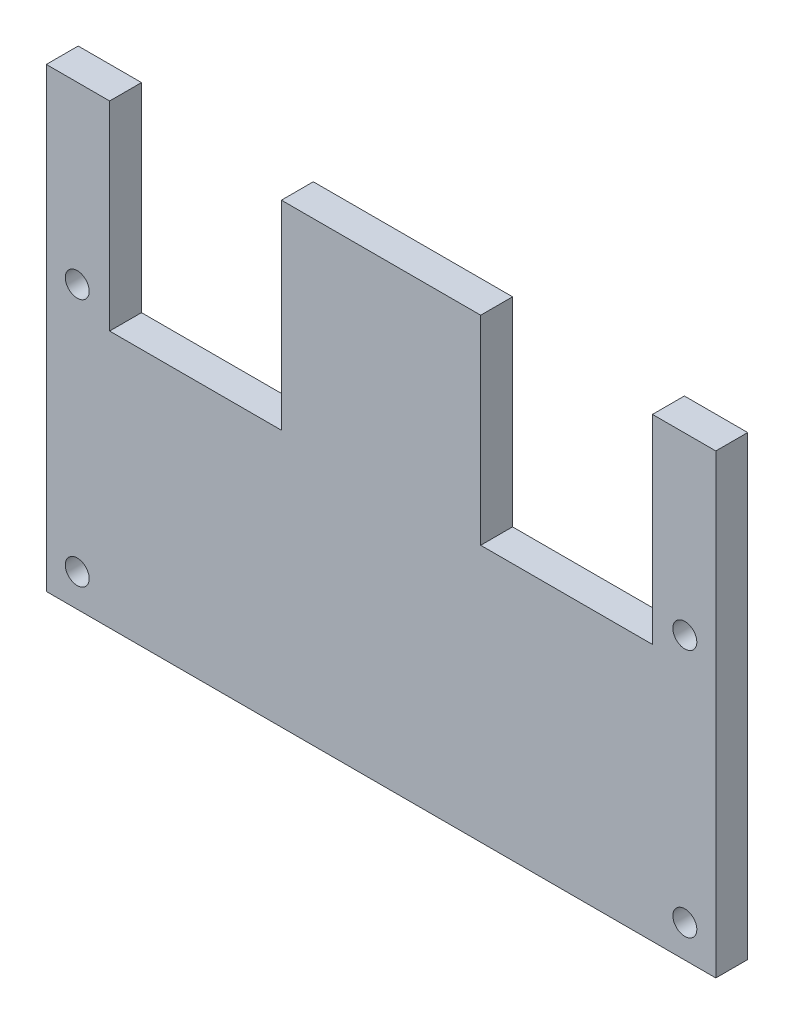
ISO-10303-21;
HEADER;
FILE_DESCRIPTION(('STEP AP214'),'2;1');
FILE_NAME('part.step','',(''),(''),'','','');
FILE_SCHEMA(('AUTOMOTIVE_DESIGN { 1 0 10303 214 1 1 1 1 }'));
ENDSEC;
DATA;
#1=APPLICATION_CONTEXT('core data for automotive mechanical design processes');
#2=APPLICATION_PROTOCOL_DEFINITION('international standard','automotive_design',2000,#1);
#3=PRODUCT_CONTEXT('',#1,'mechanical');
#4=PRODUCT('Part','Part','',(#3));
#5=PRODUCT_RELATED_PRODUCT_CATEGORY('part','',(#4));
#6=PRODUCT_DEFINITION_FORMATION('','',#4);
#7=PRODUCT_DEFINITION_CONTEXT('part definition',#1,'design');
#8=PRODUCT_DEFINITION('design','',#6,#7);
#9=PRODUCT_DEFINITION_SHAPE('','',#8);
#10=(LENGTH_UNIT() NAMED_UNIT(*) SI_UNIT(.MILLI.,.METRE.));
#11=(NAMED_UNIT(*) PLANE_ANGLE_UNIT() SI_UNIT($,.RADIAN.));
#12=(NAMED_UNIT(*) SI_UNIT($,.STERADIAN.) SOLID_ANGLE_UNIT());
#13=UNCERTAINTY_MEASURE_WITH_UNIT(LENGTH_MEASURE(1.E-05),#10,'distance_accuracy_value','');
#14=(GEOMETRIC_REPRESENTATION_CONTEXT(3) GLOBAL_UNCERTAINTY_ASSIGNED_CONTEXT((#13)) GLOBAL_UNIT_ASSIGNED_CONTEXT((#10,
#11,#12)) REPRESENTATION_CONTEXT('',''));
#15=CARTESIAN_POINT('',(0.,0.,0.));
#16=DIRECTION('',(0.,0.,1.));
#17=DIRECTION('',(1.,0.,0.));
#18=AXIS2_PLACEMENT_3D('',#15,#16,#17);
#19=CARTESIAN_POINT('',(-12.6363941032133,32.2691800709723,4.));
#20=DIRECTION('',(-1.,0.,0.));
#21=DIRECTION('',(0.,0.,1.));
#22=AXIS2_PLACEMENT_3D('',#19,#20,#21);
#23=PLANE('',#22);
#24=DIRECTION('',(0.,1.,0.));
#25=VECTOR('',#24,1.);
#26=CARTESIAN_POINT('',(-12.6363941032133,32.2691800709723,0.));
#27=LINE('',#26,#25);
#28=CARTESIAN_POINT('',(-12.6363941032133,32.2691800709723,0.));
#29=VERTEX_POINT('',#28);
#30=CARTESIAN_POINT('',(-12.6363941032133,57.269180070972,0.));
#31=VERTEX_POINT('',#30);
#32=EDGE_CURVE('E163',#29,#31,#27,.T.);
#33=ORIENTED_EDGE('',*,*,#32,.F.);
#34=DIRECTION('',(0.,0.,-1.));
#35=VECTOR('',#34,1.);
#36=CARTESIAN_POINT('',(-12.6363941032133,32.2691800709723,4.));
#37=LINE('',#36,#35);
#38=CARTESIAN_POINT('',(-12.6363941032133,32.2691800709723,4.));
#39=VERTEX_POINT('',#38);
#40=EDGE_CURVE('E11',#39,#29,#37,.T.);
#41=ORIENTED_EDGE('',*,*,#40,.F.);
#42=DIRECTION('',(0.,1.,0.));
#43=VECTOR('',#42,1.);
#44=CARTESIAN_POINT('',(-12.6363941032133,32.2691800709723,4.));
#45=LINE('',#44,#43);
#46=CARTESIAN_POINT('',(-12.6363941032133,57.269180070972,4.));
#47=VERTEX_POINT('',#46);
#48=EDGE_CURVE('E195',#39,#47,#45,.T.);
#49=ORIENTED_EDGE('',*,*,#48,.T.);
#50=DIRECTION('',(0.,0.,-1.));
#51=VECTOR('',#50,1.);
#52=CARTESIAN_POINT('',(-12.6363941032133,57.269180070972,4.));
#53=LINE('',#52,#51);
#54=EDGE_CURVE('E46',#47,#31,#53,.T.);
#55=ORIENTED_EDGE('',*,*,#54,.T.);
#56=EDGE_LOOP('',(#33,#41,#49,#55));
#57=FACE_BOUND('',#56,.T.);
#58=ADVANCED_FACE('F43',(#57),#23,.T.);
#59=CARTESIAN_POINT('',(-34.1913941032133,32.2691800709723,4.));
#60=DIRECTION('',(0.,1.,0.));
#61=DIRECTION('',(-1.,0.,0.));
#62=AXIS2_PLACEMENT_3D('',#59,#60,#61);
#63=PLANE('',#62);
#64=DIRECTION('',(1.,0.,0.));
#65=VECTOR('',#64,1.);
#66=CARTESIAN_POINT('',(-34.1913941032133,32.2691800709723,0.));
#67=LINE('',#66,#65);
#68=CARTESIAN_POINT('',(-34.1913941032133,32.2691800709723,0.));
#69=VERTEX_POINT('',#68);
#70=EDGE_CURVE('E193',#69,#29,#67,.T.);
#71=ORIENTED_EDGE('',*,*,#70,.F.);
#72=DIRECTION('',(0.,0.,-1.));
#73=VECTOR('',#72,1.);
#74=CARTESIAN_POINT('',(-34.1913941032133,32.2691800709723,4.));
#75=LINE('',#74,#73);
#76=CARTESIAN_POINT('',(-34.1913941032133,32.2691800709723,4.));
#77=VERTEX_POINT('',#76);
#78=EDGE_CURVE('E52',#77,#69,#75,.T.);
#79=ORIENTED_EDGE('',*,*,#78,.F.);
#80=DIRECTION('',(1.,0.,0.));
#81=VECTOR('',#80,1.);
#82=CARTESIAN_POINT('',(-34.1913941032133,32.2691800709723,4.));
#83=LINE('',#82,#81);
#84=EDGE_CURVE('E143',#77,#39,#83,.T.);
#85=ORIENTED_EDGE('',*,*,#84,.T.);
#86=ORIENTED_EDGE('',*,*,#40,.T.);
#87=EDGE_LOOP('',(#71,#79,#85,#86));
#88=FACE_BOUND('',#87,.T.);
#89=ADVANCED_FACE('F217',(#88),#63,.T.);
#90=CARTESIAN_POINT('',(-34.1913941032133,32.2691800709723,4.));
#91=DIRECTION('',(-1.,0.,0.));
#92=DIRECTION('',(0.,0.,1.));
#93=AXIS2_PLACEMENT_3D('',#90,#91,#92);
#94=PLANE('',#93);
#95=DIRECTION('',(0.,1.,0.));
#96=VECTOR('',#95,1.);
#97=CARTESIAN_POINT('',(-34.1913941032133,32.2691800709723,0.));
#98=LINE('',#97,#96);
#99=CARTESIAN_POINT('',(-34.1913941032133,57.269180070972,0.));
#100=VERTEX_POINT('',#99);
#101=EDGE_CURVE('E148',#69,#100,#98,.T.);
#102=ORIENTED_EDGE('',*,*,#101,.T.);
#103=DIRECTION('',(0.,0.,-1.));
#104=VECTOR('',#103,1.);
#105=CARTESIAN_POINT('',(-34.1913941032133,57.269180070972,4.));
#106=LINE('',#105,#104);
#107=CARTESIAN_POINT('',(-34.1913941032133,57.269180070972,4.));
#108=VERTEX_POINT('',#107);
#109=EDGE_CURVE('E146',#108,#100,#106,.T.);
#110=ORIENTED_EDGE('',*,*,#109,.F.);
#111=DIRECTION('',(0.,1.,0.));
#112=VECTOR('',#111,1.);
#113=CARTESIAN_POINT('',(-34.1913941032133,32.2691800709723,4.));
#114=LINE('',#113,#112);
#115=EDGE_CURVE('E137',#77,#108,#114,.T.);
#116=ORIENTED_EDGE('',*,*,#115,.F.);
#117=ORIENTED_EDGE('',*,*,#78,.T.);
#118=EDGE_LOOP('',(#102,#110,#116,#117));
#119=FACE_BOUND('',#118,.T.);
#120=ADVANCED_FACE('F147',(#119),#94,.F.);
#121=CARTESIAN_POINT('',(-34.1913941032133,57.269180070972,4.));
#122=DIRECTION('',(0.,-1.,0.));
#123=DIRECTION('',(1.,0.,0.));
#124=AXIS2_PLACEMENT_3D('',#121,#122,#123);
#125=PLANE('',#124);
#126=DIRECTION('',(-1.,0.,0.));
#127=VECTOR('',#126,1.);
#128=CARTESIAN_POINT('',(-34.1913941032133,57.269180070972,0.));
#129=LINE('',#128,#127);
#130=CARTESIAN_POINT('',(-42.1363941032133,57.269180070972,0.));
#131=VERTEX_POINT('',#130);
#132=EDGE_CURVE('E190',#100,#131,#129,.T.);
#133=ORIENTED_EDGE('',*,*,#132,.T.);
#134=DIRECTION('',(0.,0.,-1.));
#135=VECTOR('',#134,1.);
#136=CARTESIAN_POINT('',(-42.1363941032133,57.269180070972,4.));
#137=LINE('',#136,#135);
#138=CARTESIAN_POINT('',(-42.1363941032133,57.269180070972,4.));
#139=VERTEX_POINT('',#138);
#140=EDGE_CURVE('E151',#139,#131,#137,.T.);
#141=ORIENTED_EDGE('',*,*,#140,.F.);
#142=DIRECTION('',(-1.,0.,0.));
#143=VECTOR('',#142,1.);
#144=CARTESIAN_POINT('',(-34.1913941032133,57.269180070972,4.));
#145=LINE('',#144,#143);
#146=EDGE_CURVE('E141',#108,#139,#145,.T.);
#147=ORIENTED_EDGE('',*,*,#146,.F.);
#148=ORIENTED_EDGE('',*,*,#109,.T.);
#149=EDGE_LOOP('',(#133,#141,#147,#148));
#150=FACE_BOUND('',#149,.T.);
#151=ADVANCED_FACE('F153',(#150),#125,.F.);
#152=CARTESIAN_POINT('',(-42.1363941032133,57.269180070972,4.));
#153=DIRECTION('',(1.,0.,0.));
#154=DIRECTION('',(0.,1.,0.));
#155=AXIS2_PLACEMENT_3D('',#152,#153,#154);
#156=PLANE('',#155);
#157=DIRECTION('',(0.,-1.,0.));
#158=VECTOR('',#157,1.);
#159=CARTESIAN_POINT('',(-42.1363941032133,57.269180070972,0.));
#160=LINE('',#159,#158);
#161=CARTESIAN_POINT('',(-42.1363941032133,0.,0.));
#162=VERTEX_POINT('',#161);
#163=EDGE_CURVE('E188',#131,#162,#160,.T.);
#164=ORIENTED_EDGE('',*,*,#163,.T.);
#165=DIRECTION('',(0.,0.,-1.));
#166=VECTOR('',#165,1.);
#167=CARTESIAN_POINT('',(-42.1363941032133,0.,4.));
#168=LINE('',#167,#166);
#169=CARTESIAN_POINT('',(-42.1363941032133,0.,4.));
#170=VERTEX_POINT('',#169);
#171=EDGE_CURVE('E199',#170,#162,#168,.T.);
#172=ORIENTED_EDGE('',*,*,#171,.F.);
#173=DIRECTION('',(0.,-1.,0.));
#174=VECTOR('',#173,1.);
#175=CARTESIAN_POINT('',(-42.1363941032133,57.269180070972,4.));
#176=LINE('',#175,#174);
#177=EDGE_CURVE('E156',#139,#170,#176,.T.);
#178=ORIENTED_EDGE('',*,*,#177,.F.);
#179=ORIENTED_EDGE('',*,*,#140,.T.);
#180=EDGE_LOOP('',(#164,#172,#178,#179));
#181=FACE_BOUND('',#180,.T.);
#182=ADVANCED_FACE('F230',(#181),#156,.F.);
#183=CARTESIAN_POINT('',(-42.1363941032133,0.,4.));
#184=DIRECTION('',(0.,1.,0.));
#185=DIRECTION('',(0.,0.,1.));
#186=AXIS2_PLACEMENT_3D('',#183,#184,#185);
#187=PLANE('',#186);
#188=DIRECTION('',(1.,0.,0.));
#189=VECTOR('',#188,1.);
#190=CARTESIAN_POINT('',(-42.1363941032133,0.,0.));
#191=LINE('',#190,#189);
#192=CARTESIAN_POINT('',(41.8636058967867,0.,0.));
#193=VERTEX_POINT('',#192);
#194=EDGE_CURVE('E185',#162,#193,#191,.T.);
#195=ORIENTED_EDGE('',*,*,#194,.T.);
#196=DIRECTION('',(0.,0.,-1.));
#197=VECTOR('',#196,1.);
#198=CARTESIAN_POINT('',(41.8636058967867,0.,4.));
#199=LINE('',#198,#197);
#200=CARTESIAN_POINT('',(41.8636058967867,0.,4.));
#201=VERTEX_POINT('',#200);
#202=EDGE_CURVE('E202',#201,#193,#199,.T.);
#203=ORIENTED_EDGE('',*,*,#202,.F.);
#204=DIRECTION('',(1.,0.,0.));
#205=VECTOR('',#204,1.);
#206=CARTESIAN_POINT('',(-42.1363941032133,0.,4.));
#207=LINE('',#206,#205);
#208=EDGE_CURVE('E158',#170,#201,#207,.T.);
#209=ORIENTED_EDGE('',*,*,#208,.F.);
#210=ORIENTED_EDGE('',*,*,#171,.T.);
#211=EDGE_LOOP('',(#195,#203,#209,#210));
#212=FACE_BOUND('',#211,.T.);
#213=ADVANCED_FACE('F233',(#212),#187,.F.);
#214=CARTESIAN_POINT('',(41.8636058967867,57.269180070972,4.));
#215=DIRECTION('',(1.,0.,0.));
#216=DIRECTION('',(0.,1.,0.));
#217=AXIS2_PLACEMENT_3D('',#214,#215,#216);
#218=PLANE('',#217);
#219=DIRECTION('',(0.,-1.,0.));
#220=VECTOR('',#219,1.);
#221=CARTESIAN_POINT('',(41.8636058967867,57.269180070972,0.));
#222=LINE('',#221,#220);
#223=CARTESIAN_POINT('',(41.8636058967867,57.269180070972,0.));
#224=VERTEX_POINT('',#223);
#225=EDGE_CURVE('E182',#224,#193,#222,.T.);
#226=ORIENTED_EDGE('',*,*,#225,.F.);
#227=DIRECTION('',(0.,0.,-1.));
#228=VECTOR('',#227,1.);
#229=CARTESIAN_POINT('',(41.8636058967867,57.269180070972,4.));
#230=LINE('',#229,#228);
#231=CARTESIAN_POINT('',(41.8636058967867,57.269180070972,4.));
#232=VERTEX_POINT('',#231);
#233=EDGE_CURVE('E204',#232,#224,#230,.T.);
#234=ORIENTED_EDGE('',*,*,#233,.F.);
#235=DIRECTION('',(0.,-1.,0.));
#236=VECTOR('',#235,1.);
#237=CARTESIAN_POINT('',(41.8636058967867,57.269180070972,4.));
#238=LINE('',#237,#236);
#239=EDGE_CURVE('E319',#232,#201,#238,.T.);
#240=ORIENTED_EDGE('',*,*,#239,.T.);
#241=ORIENTED_EDGE('',*,*,#202,.T.);
#242=EDGE_LOOP('',(#226,#234,#240,#241));
#243=FACE_BOUND('',#242,.T.);
#244=ADVANCED_FACE('F237',(#243),#218,.T.);
#245=CARTESIAN_POINT('',(33.9186058967867,57.269180070972,4.));
#246=DIRECTION('',(0.,1.,0.));
#247=DIRECTION('',(-1.,0.,0.));
#248=AXIS2_PLACEMENT_3D('',#245,#246,#247);
#249=PLANE('',#248);
#250=DIRECTION('',(1.,0.,0.));
#251=VECTOR('',#250,1.);
#252=CARTESIAN_POINT('',(33.9186058967867,57.269180070972,0.));
#253=LINE('',#252,#251);
#254=CARTESIAN_POINT('',(33.9186058967867,57.269180070972,0.));
#255=VERTEX_POINT('',#254);
#256=EDGE_CURVE('E179',#255,#224,#253,.T.);
#257=ORIENTED_EDGE('',*,*,#256,.F.);
#258=DIRECTION('',(0.,0.,-1.));
#259=VECTOR('',#258,1.);
#260=CARTESIAN_POINT('',(33.9186058967867,57.269180070972,4.));
#261=LINE('',#260,#259);
#262=CARTESIAN_POINT('',(33.9186058967867,57.269180070972,4.));
#263=VERTEX_POINT('',#262);
#264=EDGE_CURVE('E206',#263,#255,#261,.T.);
#265=ORIENTED_EDGE('',*,*,#264,.F.);
#266=DIRECTION('',(1.,0.,0.));
#267=VECTOR('',#266,1.);
#268=CARTESIAN_POINT('',(33.9186058967867,57.269180070972,4.));
#269=LINE('',#268,#267);
#270=EDGE_CURVE('E316',#263,#232,#269,.T.);
#271=ORIENTED_EDGE('',*,*,#270,.T.);
#272=ORIENTED_EDGE('',*,*,#233,.T.);
#273=EDGE_LOOP('',(#257,#265,#271,#272));
#274=FACE_BOUND('',#273,.T.);
#275=ADVANCED_FACE('F241',(#274),#249,.T.);
#276=CARTESIAN_POINT('',(33.9186058967867,32.2691800709723,4.));
#277=DIRECTION('',(-1.,0.,0.));
#278=DIRECTION('',(0.,0.,1.));
#279=AXIS2_PLACEMENT_3D('',#276,#277,#278);
#280=PLANE('',#279);
#281=DIRECTION('',(0.,1.,0.));
#282=VECTOR('',#281,1.);
#283=CARTESIAN_POINT('',(33.9186058967867,32.2691800709723,0.));
#284=LINE('',#283,#282);
#285=CARTESIAN_POINT('',(33.9186058967867,32.2691800709723,0.));
#286=VERTEX_POINT('',#285);
#287=EDGE_CURVE('E176',#286,#255,#284,.T.);
#288=ORIENTED_EDGE('',*,*,#287,.F.);
#289=DIRECTION('',(0.,0.,-1.));
#290=VECTOR('',#289,1.);
#291=CARTESIAN_POINT('',(33.9186058967867,32.2691800709723,4.));
#292=LINE('',#291,#290);
#293=CARTESIAN_POINT('',(33.9186058967867,32.2691800709723,4.));
#294=VERTEX_POINT('',#293);
#295=EDGE_CURVE('E208',#294,#286,#292,.T.);
#296=ORIENTED_EDGE('',*,*,#295,.F.);
#297=DIRECTION('',(0.,1.,0.));
#298=VECTOR('',#297,1.);
#299=CARTESIAN_POINT('',(33.9186058967867,32.2691800709723,4.));
#300=LINE('',#299,#298);
#301=EDGE_CURVE('E313',#294,#263,#300,.T.);
#302=ORIENTED_EDGE('',*,*,#301,.T.);
#303=ORIENTED_EDGE('',*,*,#264,.T.);
#304=EDGE_LOOP('',(#288,#296,#302,#303));
#305=FACE_BOUND('',#304,.T.);
#306=ADVANCED_FACE('F245',(#305),#280,.T.);
#307=CARTESIAN_POINT('',(12.3636058967867,32.2691800709723,4.));
#308=DIRECTION('',(0.,1.,0.));
#309=DIRECTION('',(-1.,0.,0.));
#310=AXIS2_PLACEMENT_3D('',#307,#308,#309);
#311=PLANE('',#310);
#312=DIRECTION('',(1.,0.,0.));
#313=VECTOR('',#312,1.);
#314=CARTESIAN_POINT('',(12.3636058967867,32.2691800709723,0.));
#315=LINE('',#314,#313);
#316=CARTESIAN_POINT('',(12.3636058967867,32.2691800709723,0.));
#317=VERTEX_POINT('',#316);
#318=EDGE_CURVE('E173',#317,#286,#315,.T.);
#319=ORIENTED_EDGE('',*,*,#318,.F.);
#320=DIRECTION('',(0.,0.,-1.));
#321=VECTOR('',#320,1.);
#322=CARTESIAN_POINT('',(12.3636058967867,32.2691800709723,4.));
#323=LINE('',#322,#321);
#324=CARTESIAN_POINT('',(12.3636058967867,32.2691800709723,4.));
#325=VERTEX_POINT('',#324);
#326=EDGE_CURVE('E210',#325,#317,#323,.T.);
#327=ORIENTED_EDGE('',*,*,#326,.F.);
#328=DIRECTION('',(1.,0.,0.));
#329=VECTOR('',#328,1.);
#330=CARTESIAN_POINT('',(12.3636058967867,32.2691800709723,4.));
#331=LINE('',#330,#329);
#332=EDGE_CURVE('E310',#325,#294,#331,.T.);
#333=ORIENTED_EDGE('',*,*,#332,.T.);
#334=ORIENTED_EDGE('',*,*,#295,.T.);
#335=EDGE_LOOP('',(#319,#327,#333,#334));
#336=FACE_BOUND('',#335,.T.);
#337=ADVANCED_FACE('F249',(#336),#311,.T.);
#338=CARTESIAN_POINT('',(12.3636058967867,32.2691800709723,4.));
#339=DIRECTION('',(-1.,0.,0.));
#340=DIRECTION('',(0.,0.,1.));
#341=AXIS2_PLACEMENT_3D('',#338,#339,#340);
#342=PLANE('',#341);
#343=DIRECTION('',(0.,1.,0.));
#344=VECTOR('',#343,1.);
#345=CARTESIAN_POINT('',(12.3636058967867,32.2691800709723,0.));
#346=LINE('',#345,#344);
#347=CARTESIAN_POINT('',(12.3636058967867,57.269180070972,0.));
#348=VERTEX_POINT('',#347);
#349=EDGE_CURVE('E170',#317,#348,#346,.T.);
#350=ORIENTED_EDGE('',*,*,#349,.T.);
#351=DIRECTION('',(0.,0.,-1.));
#352=VECTOR('',#351,1.);
#353=CARTESIAN_POINT('',(12.3636058967867,57.269180070972,4.));
#354=LINE('',#353,#352);
#355=CARTESIAN_POINT('',(12.3636058967867,57.269180070972,4.));
#356=VERTEX_POINT('',#355);
#357=EDGE_CURVE('E211',#356,#348,#354,.T.);
#358=ORIENTED_EDGE('',*,*,#357,.F.);
#359=DIRECTION('',(0.,1.,0.));
#360=VECTOR('',#359,1.);
#361=CARTESIAN_POINT('',(12.3636058967867,32.2691800709723,4.));
#362=LINE('',#361,#360);
#363=EDGE_CURVE('E308',#325,#356,#362,.T.);
#364=ORIENTED_EDGE('',*,*,#363,.F.);
#365=ORIENTED_EDGE('',*,*,#326,.T.);
#366=EDGE_LOOP('',(#350,#358,#364,#365));
#367=FACE_BOUND('',#366,.T.);
#368=ADVANCED_FACE('F253',(#367),#342,.F.);
#369=CARTESIAN_POINT('',(-12.6363941032133,57.269180070972,4.));
#370=DIRECTION('',(0.,1.,0.));
#371=DIRECTION('',(-1.,0.,0.));
#372=AXIS2_PLACEMENT_3D('',#369,#370,#371);
#373=PLANE('',#372);
#374=DIRECTION('',(1.,0.,0.));
#375=VECTOR('',#374,1.);
#376=CARTESIAN_POINT('',(-12.6363941032133,57.269180070972,0.));
#377=LINE('',#376,#375);
#378=EDGE_CURVE('E166',#31,#348,#377,.T.);
#379=ORIENTED_EDGE('',*,*,#378,.F.);
#380=ORIENTED_EDGE('',*,*,#54,.F.);
#381=DIRECTION('',(1.,0.,0.));
#382=VECTOR('',#381,1.);
#383=CARTESIAN_POINT('',(-12.6363941032133,57.269180070972,4.));
#384=LINE('',#383,#382);
#385=EDGE_CURVE('E306',#47,#356,#384,.T.);
#386=ORIENTED_EDGE('',*,*,#385,.T.);
#387=ORIENTED_EDGE('',*,*,#357,.T.);
#388=EDGE_LOOP('',(#379,#380,#386,#387));
#389=FACE_BOUND('',#388,.T.);
#390=ADVANCED_FACE('F213',(#389),#373,.T.);
#391=CARTESIAN_POINT('',(0.,0.,4.));
#392=DIRECTION('',(0.,0.,-1.));
#393=DIRECTION('',(-1.,0.,0.));
#394=AXIS2_PLACEMENT_3D('',#391,#392,#393);
#395=PLANE('',#394);
#396=CARTESIAN_POINT('',(37.9809116353009,4.07787742802348,4.));
#397=DIRECTION('',(0.,0.,-1.));
#398=DIRECTION('',(-1.,0.,0.));
#399=AXIS2_PLACEMENT_3D('',#396,#397,#398);
#400=CIRCLE('',#399,1.5);
#401=CARTESIAN_POINT('',(36.4809116353009,4.07787742802348,4.));
#402=VERTEX_POINT('',#401);
#403=EDGE_CURVE('E167',#402,#402,#400,.T.);
#404=ORIENTED_EDGE('',*,*,#403,.T.);
#405=EDGE_LOOP('',(#404));
#406=FACE_BOUND('',#405,.T.);
#407=CARTESIAN_POINT('',(37.9809116353009,35.3060469833632,4.));
#408=DIRECTION('',(0.,0.,-1.));
#409=DIRECTION('',(-1.,0.,0.));
#410=AXIS2_PLACEMENT_3D('',#407,#408,#409);
#411=CIRCLE('',#410,1.5);
#412=CARTESIAN_POINT('',(36.4809116353009,35.3060469833632,4.));
#413=VERTEX_POINT('',#412);
#414=EDGE_CURVE('E294',#413,#413,#411,.T.);
#415=ORIENTED_EDGE('',*,*,#414,.T.);
#416=EDGE_LOOP('',(#415));
#417=FACE_BOUND('',#416,.T.);
#418=CARTESIAN_POINT('',(-38.2536998417276,35.3060469833632,4.));
#419=DIRECTION('',(0.,0.,-1.));
#420=DIRECTION('',(-1.,0.,0.));
#421=AXIS2_PLACEMENT_3D('',#418,#419,#420);
#422=CIRCLE('',#421,1.5);
#423=CARTESIAN_POINT('',(-39.7536998417276,35.3060469833632,4.));
#424=VERTEX_POINT('',#423);
#425=EDGE_CURVE('E292',#424,#424,#422,.T.);
#426=ORIENTED_EDGE('',*,*,#425,.T.);
#427=EDGE_LOOP('',(#426));
#428=FACE_BOUND('',#427,.T.);
#429=CARTESIAN_POINT('',(-38.2536998417276,4.07787742802348,4.));
#430=DIRECTION('',(0.,0.,-1.));
#431=DIRECTION('',(-1.,0.,0.));
#432=AXIS2_PLACEMENT_3D('',#429,#430,#431);
#433=CIRCLE('',#432,1.5);
#434=CARTESIAN_POINT('',(-39.7536998417276,4.07787742802348,4.));
#435=VERTEX_POINT('',#434);
#436=EDGE_CURVE('E295',#435,#435,#433,.T.);
#437=ORIENTED_EDGE('',*,*,#436,.T.);
#438=EDGE_LOOP('',(#437));
#439=FACE_BOUND('',#438,.T.);
#440=ORIENTED_EDGE('',*,*,#48,.F.);
#441=ORIENTED_EDGE('',*,*,#84,.F.);
#442=ORIENTED_EDGE('',*,*,#115,.T.);
#443=ORIENTED_EDGE('',*,*,#146,.T.);
#444=ORIENTED_EDGE('',*,*,#177,.T.);
#445=ORIENTED_EDGE('',*,*,#208,.T.);
#446=ORIENTED_EDGE('',*,*,#239,.F.);
#447=ORIENTED_EDGE('',*,*,#270,.F.);
#448=ORIENTED_EDGE('',*,*,#301,.F.);
#449=ORIENTED_EDGE('',*,*,#332,.F.);
#450=ORIENTED_EDGE('',*,*,#363,.T.);
#451=ORIENTED_EDGE('',*,*,#385,.F.);
#452=EDGE_LOOP('',(#440,#441,#442,#443,#444,#445,#446,#447,#448,#449,#450,#451));
#453=FACE_BOUND('',#452,.T.);
#454=ADVANCED_FACE('F139',(#406,#417,#428,#439,#453),#395,.F.);
#455=CARTESIAN_POINT('',(0.,0.,0.));
#456=DIRECTION('',(0.,0.,-1.));
#457=DIRECTION('',(-1.,0.,0.));
#458=AXIS2_PLACEMENT_3D('',#455,#456,#457);
#459=PLANE('',#458);
#460=CARTESIAN_POINT('',(37.9809116353009,4.07787742802348,0.));
#461=DIRECTION('',(0.,0.,1.));
#462=DIRECTION('',(-1.,0.,0.));
#463=AXIS2_PLACEMENT_3D('',#460,#461,#462);
#464=CIRCLE('',#463,1.5);
#465=CARTESIAN_POINT('',(36.4809116353009,4.07787742802348,0.));
#466=VERTEX_POINT('',#465);
#467=EDGE_CURVE('E339',#466,#466,#464,.T.);
#468=ORIENTED_EDGE('',*,*,#467,.T.);
#469=EDGE_LOOP('',(#468));
#470=FACE_BOUND('',#469,.T.);
#471=CARTESIAN_POINT('',(37.9809116353009,35.3060469833632,0.));
#472=DIRECTION('',(0.,0.,1.));
#473=DIRECTION('',(-1.,0.,0.));
#474=AXIS2_PLACEMENT_3D('',#471,#472,#473);
#475=CIRCLE('',#474,1.5);
#476=CARTESIAN_POINT('',(36.4809116353009,35.3060469833632,0.));
#477=VERTEX_POINT('',#476);
#478=EDGE_CURVE('E342',#477,#477,#475,.T.);
#479=ORIENTED_EDGE('',*,*,#478,.T.);
#480=EDGE_LOOP('',(#479));
#481=FACE_BOUND('',#480,.T.);
#482=CARTESIAN_POINT('',(-38.2536998417276,35.3060469833632,0.));
#483=DIRECTION('',(0.,0.,1.));
#484=DIRECTION('',(1.,0.,0.));
#485=AXIS2_PLACEMENT_3D('',#482,#483,#484);
#486=CIRCLE('',#485,1.5);
#487=CARTESIAN_POINT('',(-36.7536998417276,35.3060469833632,0.));
#488=VERTEX_POINT('',#487);
#489=EDGE_CURVE('E289',#488,#488,#486,.T.);
#490=ORIENTED_EDGE('',*,*,#489,.T.);
#491=EDGE_LOOP('',(#490));
#492=FACE_BOUND('',#491,.T.);
#493=CARTESIAN_POINT('',(-38.2536998417276,4.07787742802348,0.));
#494=DIRECTION('',(0.,0.,1.));
#495=DIRECTION('',(1.,0.,0.));
#496=AXIS2_PLACEMENT_3D('',#493,#494,#495);
#497=CIRCLE('',#496,1.5);
#498=CARTESIAN_POINT('',(-36.7536998417276,4.07787742802348,0.));
#499=VERTEX_POINT('',#498);
#500=EDGE_CURVE('E300',#499,#499,#497,.T.);
#501=ORIENTED_EDGE('',*,*,#500,.T.);
#502=EDGE_LOOP('',(#501));
#503=FACE_BOUND('',#502,.T.);
#504=ORIENTED_EDGE('',*,*,#32,.T.);
#505=ORIENTED_EDGE('',*,*,#378,.T.);
#506=ORIENTED_EDGE('',*,*,#349,.F.);
#507=ORIENTED_EDGE('',*,*,#318,.T.);
#508=ORIENTED_EDGE('',*,*,#287,.T.);
#509=ORIENTED_EDGE('',*,*,#256,.T.);
#510=ORIENTED_EDGE('',*,*,#225,.T.);
#511=ORIENTED_EDGE('',*,*,#194,.F.);
#512=ORIENTED_EDGE('',*,*,#163,.F.);
#513=ORIENTED_EDGE('',*,*,#132,.F.);
#514=ORIENTED_EDGE('',*,*,#101,.F.);
#515=ORIENTED_EDGE('',*,*,#70,.T.);
#516=EDGE_LOOP('',(#504,#505,#506,#507,#508,#509,#510,#511,#512,#513,#514,#515));
#517=FACE_BOUND('',#516,.T.);
#518=ADVANCED_FACE('F216',(#470,#481,#492,#503,#517),#459,.T.);
#519=CARTESIAN_POINT('',(-38.2536998417276,4.07787742802348,0.));
#520=DIRECTION('',(0.,0.,1.));
#521=DIRECTION('',(1.,0.,0.));
#522=AXIS2_PLACEMENT_3D('',#519,#520,#521);
#523=CYLINDRICAL_SURFACE('',#522,1.5);
#524=ORIENTED_EDGE('',*,*,#500,.F.);
#525=EDGE_LOOP('',(#524));
#526=FACE_BOUND('',#525,.T.);
#527=ORIENTED_EDGE('',*,*,#436,.F.);
#528=EDGE_LOOP('',(#527));
#529=FACE_BOUND('',#528,.T.);
#530=ADVANCED_FACE('F265',(#526,#529),#523,.F.);
#531=CARTESIAN_POINT('',(-38.2536998417276,35.3060469833632,0.));
#532=DIRECTION('',(0.,0.,1.));
#533=DIRECTION('',(1.,0.,0.));
#534=AXIS2_PLACEMENT_3D('',#531,#532,#533);
#535=CYLINDRICAL_SURFACE('',#534,1.5);
#536=ORIENTED_EDGE('',*,*,#489,.F.);
#537=EDGE_LOOP('',(#536));
#538=FACE_BOUND('',#537,.T.);
#539=ORIENTED_EDGE('',*,*,#425,.F.);
#540=EDGE_LOOP('',(#539));
#541=FACE_BOUND('',#540,.T.);
#542=ADVANCED_FACE('F272',(#538,#541),#535,.F.);
#543=CARTESIAN_POINT('',(37.9809116353009,35.3060469833632,0.));
#544=DIRECTION('',(0.,0.,1.));
#545=DIRECTION('',(1.,0.,0.));
#546=AXIS2_PLACEMENT_3D('',#543,#544,#545);
#547=CYLINDRICAL_SURFACE('',#546,1.5);
#548=ORIENTED_EDGE('',*,*,#478,.F.);
#549=EDGE_LOOP('',(#548));
#550=FACE_BOUND('',#549,.T.);
#551=ORIENTED_EDGE('',*,*,#414,.F.);
#552=EDGE_LOOP('',(#551));
#553=FACE_BOUND('',#552,.T.);
#554=ADVANCED_FACE('F277',(#550,#553),#547,.F.);
#555=CARTESIAN_POINT('',(37.9809116353009,4.07787742802348,0.));
#556=DIRECTION('',(0.,0.,1.));
#557=DIRECTION('',(1.,0.,0.));
#558=AXIS2_PLACEMENT_3D('',#555,#556,#557);
#559=CYLINDRICAL_SURFACE('',#558,1.5);
#560=ORIENTED_EDGE('',*,*,#467,.F.);
#561=EDGE_LOOP('',(#560));
#562=FACE_BOUND('',#561,.T.);
#563=ORIENTED_EDGE('',*,*,#403,.F.);
#564=EDGE_LOOP('',(#563));
#565=FACE_BOUND('',#564,.T.);
#566=ADVANCED_FACE('F274',(#562,#565),#559,.F.);
#567=CLOSED_SHELL('',(#58,#89,#120,#151,#182,#213,#244,#275,#306,#337,#368,#390,#454,#518,#530,
#542,#554,#566));
#568=MANIFOLD_SOLID_BREP('B2',#567);
#569=ADVANCED_BREP_SHAPE_REPRESENTATION('',(#18,#568),#14);
#570=SHAPE_DEFINITION_REPRESENTATION(#9,#569);
ENDSEC;
END-ISO-10303-21;
